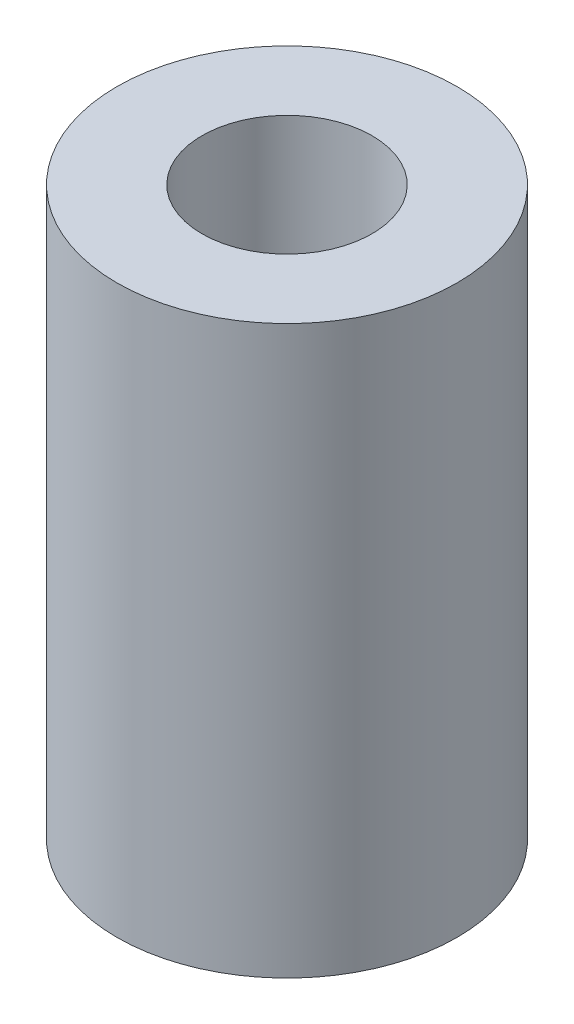
ISO-10303-21;
HEADER;
FILE_DESCRIPTION(('STEP AP214'),'2;1');
FILE_NAME('part.step','',(''),(''),'','','');
FILE_SCHEMA(('AUTOMOTIVE_DESIGN { 1 0 10303 214 1 1 1 1 }'));
ENDSEC;
DATA;
#1=APPLICATION_CONTEXT('core data for automotive mechanical design processes');
#2=APPLICATION_PROTOCOL_DEFINITION('international standard','automotive_design',2000,#1);
#3=PRODUCT_CONTEXT('',#1,'mechanical');
#4=PRODUCT('Part','Part','',(#3));
#5=PRODUCT_RELATED_PRODUCT_CATEGORY('part','',(#4));
#6=PRODUCT_DEFINITION_FORMATION('','',#4);
#7=PRODUCT_DEFINITION_CONTEXT('part definition',#1,'design');
#8=PRODUCT_DEFINITION('design','',#6,#7);
#9=PRODUCT_DEFINITION_SHAPE('','',#8);
#10=(LENGTH_UNIT() NAMED_UNIT(*) SI_UNIT(.MILLI.,.METRE.));
#11=(NAMED_UNIT(*) PLANE_ANGLE_UNIT() SI_UNIT($,.RADIAN.));
#12=(NAMED_UNIT(*) SI_UNIT($,.STERADIAN.) SOLID_ANGLE_UNIT());
#13=UNCERTAINTY_MEASURE_WITH_UNIT(LENGTH_MEASURE(1.E-05),#10,'distance_accuracy_value','');
#14=(GEOMETRIC_REPRESENTATION_CONTEXT(3) GLOBAL_UNCERTAINTY_ASSIGNED_CONTEXT((#13)) GLOBAL_UNIT_ASSIGNED_CONTEXT((#10,
#11,#12)) REPRESENTATION_CONTEXT('',''));
#15=CARTESIAN_POINT('',(0.,0.,0.));
#16=DIRECTION('',(0.,0.,1.));
#17=DIRECTION('',(1.,0.,0.));
#18=AXIS2_PLACEMENT_3D('',#15,#16,#17);
#19=CARTESIAN_POINT('',(0.,20.,0.));
#20=DIRECTION('',(0.,-1.,0.));
#21=DIRECTION('',(0.,0.,-1.));
#22=AXIS2_PLACEMENT_3D('',#19,#20,#21);
#23=CYLINDRICAL_SURFACE('',#22,6.);
#24=CARTESIAN_POINT('',(0.,20.,0.));
#25=DIRECTION('',(0.,1.,0.));
#26=DIRECTION('',(0.,0.,1.));
#27=AXIS2_PLACEMENT_3D('',#24,#25,#26);
#28=CIRCLE('',#27,6.);
#29=CARTESIAN_POINT('',(0.,20.,6.));
#30=VERTEX_POINT('',#29);
#31=EDGE_CURVE('E10',#30,#30,#28,.T.);
#32=ORIENTED_EDGE('',*,*,#31,.F.);
#33=EDGE_LOOP('',(#32));
#34=FACE_BOUND('',#33,.T.);
#35=CARTESIAN_POINT('',(0.,0.,0.));
#36=DIRECTION('',(0.,1.,0.));
#37=DIRECTION('',(0.,0.,1.));
#38=AXIS2_PLACEMENT_3D('',#35,#36,#37);
#39=CIRCLE('',#38,6.);
#40=CARTESIAN_POINT('',(0.,0.,6.));
#41=VERTEX_POINT('',#40);
#42=EDGE_CURVE('E35',#41,#41,#39,.T.);
#43=ORIENTED_EDGE('',*,*,#42,.T.);
#44=EDGE_LOOP('',(#43));
#45=FACE_BOUND('',#44,.T.);
#46=ADVANCED_FACE('F32',(#34,#45),#23,.T.);
#47=CARTESIAN_POINT('',(0.,20.,0.));
#48=DIRECTION('',(0.,1.,0.));
#49=DIRECTION('',(0.,0.,1.));
#50=AXIS2_PLACEMENT_3D('',#47,#48,#49);
#51=PLANE('',#50);
#52=CARTESIAN_POINT('',(0.,20.,0.));
#53=DIRECTION('',(0.,1.,0.));
#54=DIRECTION('',(0.,0.,1.));
#55=AXIS2_PLACEMENT_3D('',#52,#53,#54);
#56=CIRCLE('',#55,3.);
#57=CARTESIAN_POINT('',(0.,20.,3.));
#58=VERTEX_POINT('',#57);
#59=EDGE_CURVE('E44',#58,#58,#56,.T.);
#60=ORIENTED_EDGE('',*,*,#59,.F.);
#61=EDGE_LOOP('',(#60));
#62=FACE_BOUND('',#61,.T.);
#63=ORIENTED_EDGE('',*,*,#31,.T.);
#64=EDGE_LOOP('',(#63));
#65=FACE_BOUND('',#64,.T.);
#66=ADVANCED_FACE('F69',(#62,#65),#51,.T.);
#67=CARTESIAN_POINT('',(0.,0.,0.));
#68=DIRECTION('',(0.,1.,0.));
#69=DIRECTION('',(0.,0.,1.));
#70=AXIS2_PLACEMENT_3D('',#67,#68,#69);
#71=PLANE('',#70);
#72=CARTESIAN_POINT('',(0.,0.,0.));
#73=DIRECTION('',(0.,-1.,0.));
#74=DIRECTION('',(0.,0.,-1.));
#75=AXIS2_PLACEMENT_3D('',#72,#73,#74);
#76=CIRCLE('',#75,1.);
#77=CARTESIAN_POINT('',(0.,0.,-1.));
#78=VERTEX_POINT('',#77);
#79=EDGE_CURVE('E50',#78,#78,#76,.T.);
#80=ORIENTED_EDGE('',*,*,#79,.F.);
#81=EDGE_LOOP('',(#80));
#82=FACE_BOUND('',#81,.T.);
#83=ORIENTED_EDGE('',*,*,#42,.F.);
#84=EDGE_LOOP('',(#83));
#85=FACE_BOUND('',#84,.T.);
#86=ADVANCED_FACE('F65',(#82,#85),#71,.F.);
#87=CARTESIAN_POINT('',(0.,11.,0.));
#88=DIRECTION('',(0.,1.,0.));
#89=DIRECTION('',(0.,0.,1.));
#90=AXIS2_PLACEMENT_3D('',#87,#88,#89);
#91=CYLINDRICAL_SURFACE('',#90,3.);
#92=CARTESIAN_POINT('',(0.,11.,0.));
#93=DIRECTION('',(0.,1.,0.));
#94=DIRECTION('',(0.,0.,1.));
#95=AXIS2_PLACEMENT_3D('',#92,#93,#94);
#96=CIRCLE('',#95,3.);
#97=CARTESIAN_POINT('',(0.,11.,3.));
#98=VERTEX_POINT('',#97);
#99=EDGE_CURVE('E42',#98,#98,#96,.T.);
#100=ORIENTED_EDGE('',*,*,#99,.F.);
#101=EDGE_LOOP('',(#100));
#102=FACE_BOUND('',#101,.T.);
#103=ORIENTED_EDGE('',*,*,#59,.T.);
#104=EDGE_LOOP('',(#103));
#105=FACE_BOUND('',#104,.T.);
#106=ADVANCED_FACE('F68',(#102,#105),#91,.F.);
#107=CARTESIAN_POINT('',(0.,11.,0.));
#108=DIRECTION('',(0.,1.,0.));
#109=DIRECTION('',(0.,0.,1.));
#110=AXIS2_PLACEMENT_3D('',#107,#108,#109);
#111=PLANE('',#110);
#112=ORIENTED_EDGE('',*,*,#99,.T.);
#113=EDGE_LOOP('',(#112));
#114=FACE_BOUND('',#113,.T.);
#115=ADVANCED_FACE('F61',(#114),#111,.T.);
#116=CARTESIAN_POINT('',(0.,9.,0.));
#117=DIRECTION('',(0.,-1.,0.));
#118=DIRECTION('',(0.,0.,-1.));
#119=AXIS2_PLACEMENT_3D('',#116,#117,#118);
#120=CYLINDRICAL_SURFACE('',#119,1.);
#121=CARTESIAN_POINT('',(0.,9.,0.));
#122=DIRECTION('',(0.,-1.,0.));
#123=DIRECTION('',(0.,0.,-1.));
#124=AXIS2_PLACEMENT_3D('',#121,#122,#123);
#125=CIRCLE('',#124,1.);
#126=CARTESIAN_POINT('',(0.,9.,-1.));
#127=VERTEX_POINT('',#126);
#128=EDGE_CURVE('E47',#127,#127,#125,.T.);
#129=ORIENTED_EDGE('',*,*,#128,.F.);
#130=EDGE_LOOP('',(#129));
#131=FACE_BOUND('',#130,.T.);
#132=ORIENTED_EDGE('',*,*,#79,.T.);
#133=EDGE_LOOP('',(#132));
#134=FACE_BOUND('',#133,.T.);
#135=ADVANCED_FACE('F58',(#131,#134),#120,.F.);
#136=CARTESIAN_POINT('',(0.,9.,0.));
#137=DIRECTION('',(0.,-1.,0.));
#138=DIRECTION('',(0.,0.,-1.));
#139=AXIS2_PLACEMENT_3D('',#136,#137,#138);
#140=PLANE('',#139);
#141=ORIENTED_EDGE('',*,*,#128,.T.);
#142=EDGE_LOOP('',(#141));
#143=FACE_BOUND('',#142,.T.);
#144=ADVANCED_FACE('F56',(#143),#140,.T.);
#145=CLOSED_SHELL('',(#46,#66,#86,#106,#115,#135,#144));
#146=MANIFOLD_SOLID_BREP('B2',#145);
#147=ADVANCED_BREP_SHAPE_REPRESENTATION('',(#18,#146),#14);
#148=SHAPE_DEFINITION_REPRESENTATION(#9,#147);
ENDSEC;
END-ISO-10303-21;
